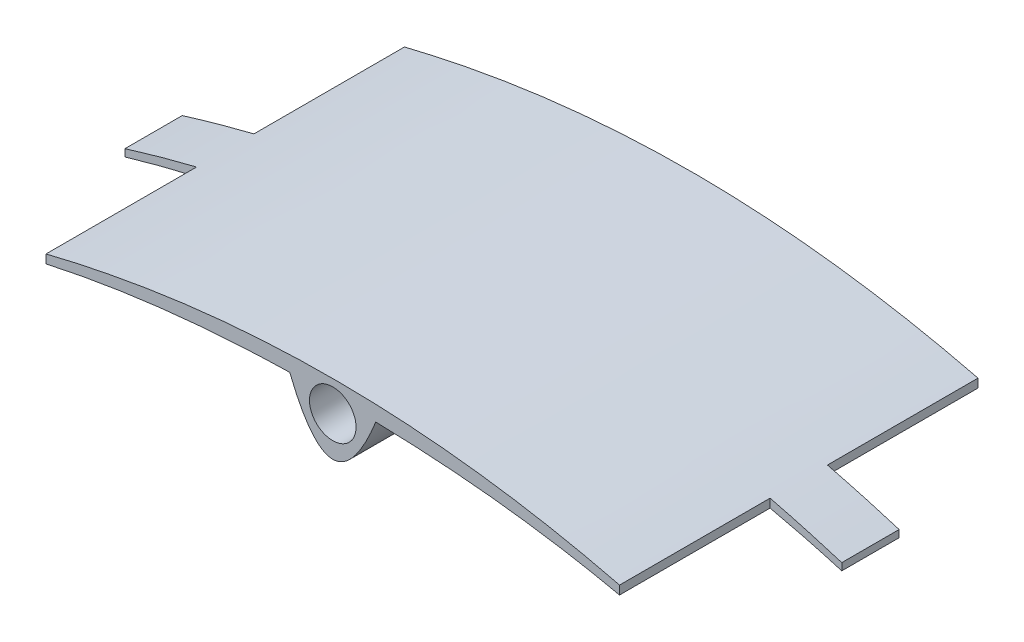
ISO-10303-21;
HEADER;
FILE_DESCRIPTION(('STEP AP214'),'2;1');
FILE_NAME('part.step','',(''),(''),'','','');
FILE_SCHEMA(('AUTOMOTIVE_DESIGN { 1 0 10303 214 1 1 1 1 }'));
ENDSEC;
DATA;
#1=APPLICATION_CONTEXT('core data for automotive mechanical design processes');
#2=APPLICATION_PROTOCOL_DEFINITION('international standard','automotive_design',2000,#1);
#3=PRODUCT_CONTEXT('',#1,'mechanical');
#4=PRODUCT('Part','Part','',(#3));
#5=PRODUCT_RELATED_PRODUCT_CATEGORY('part','',(#4));
#6=PRODUCT_DEFINITION_FORMATION('','',#4);
#7=PRODUCT_DEFINITION_CONTEXT('part definition',#1,'design');
#8=PRODUCT_DEFINITION('design','',#6,#7);
#9=PRODUCT_DEFINITION_SHAPE('','',#8);
#10=(LENGTH_UNIT() NAMED_UNIT(*) SI_UNIT(.MILLI.,.METRE.));
#11=(NAMED_UNIT(*) PLANE_ANGLE_UNIT() SI_UNIT($,.RADIAN.));
#12=(NAMED_UNIT(*) SI_UNIT($,.STERADIAN.) SOLID_ANGLE_UNIT());
#13=UNCERTAINTY_MEASURE_WITH_UNIT(LENGTH_MEASURE(1.E-05),#10,'distance_accuracy_value','');
#14=(GEOMETRIC_REPRESENTATION_CONTEXT(3) GLOBAL_UNCERTAINTY_ASSIGNED_CONTEXT((#13)) GLOBAL_UNIT_ASSIGNED_CONTEXT((#10,
#11,#12)) REPRESENTATION_CONTEXT('',''));
#15=CARTESIAN_POINT('',(0.,0.,0.));
#16=DIRECTION('',(0.,0.,1.));
#17=DIRECTION('',(1.,0.,0.));
#18=AXIS2_PLACEMENT_3D('',#15,#16,#17);
#19=CARTESIAN_POINT('',(0.,4.25967658803984,50.));
#20=DIRECTION('',(0.,0.,1.));
#21=DIRECTION('',(1.,0.,0.));
#22=AXIS2_PLACEMENT_3D('',#19,#20,#21);
#23=PLANE('',#22);
#24=DIRECTION('',(0.,1.,0.));
#25=VECTOR('',#24,1.);
#26=CARTESIAN_POINT('',(40.,-5.5,50.));
#27=LINE('',#26,#25);
#28=CARTESIAN_POINT('',(40.,-1.89787930509326,50.));
#29=VERTEX_POINT('',#28);
#30=CARTESIAN_POINT('',(40.,-0.694130395614659,50.));
#31=VERTEX_POINT('',#30);
#32=EDGE_CURVE('E158',#29,#31,#27,.T.);
#33=ORIENTED_EDGE('',*,*,#32,.T.);
#34=CARTESIAN_POINT('',(50.,-3.48064682392032,50.));
#35=CARTESIAN_POINT('',(0.,12.,50.));
#36=CARTESIAN_POINT('',(-50.,-3.48064682392032,50.));
#37=B_SPLINE_CURVE_WITH_KNOTS('',2,(#34,#35,#36),.UNSPECIFIED.,.F.,.F.,(3,3),(0.,1.),.UNSPECIFIED.);
#38=CARTESIAN_POINT('',(-40.,-0.694130395614659,50.));
#39=VERTEX_POINT('',#38);
#40=EDGE_CURVE('E166',#31,#39,#37,.T.);
#41=ORIENTED_EDGE('',*,*,#40,.T.);
#42=DIRECTION('',(0.,1.,0.));
#43=VECTOR('',#42,1.);
#44=CARTESIAN_POINT('',(-40.,-5.5,50.));
#45=LINE('',#44,#43);
#46=CARTESIAN_POINT('',(-40.,-1.89787930510449,50.));
#47=VERTEX_POINT('',#46);
#48=EDGE_CURVE('E249',#47,#39,#45,.T.);
#49=ORIENTED_EDGE('',*,*,#48,.F.);
#50=CARTESIAN_POINT('',(-50.,-4.48064682392032,50.));
#51=CARTESIAN_POINT('',(-30.,1.47316015973418,50.));
#52=CARTESIAN_POINT('',(-6.,2.,50.));
#53=B_SPLINE_CURVE_WITH_KNOTS('',2,(#50,#51,#52),.UNSPECIFIED.,.F.,.F.,(3,3),(0.,1.),.UNSPECIFIED.);
#54=CARTESIAN_POINT('',(-6.,2.,50.));
#55=VERTEX_POINT('',#54);
#56=EDGE_CURVE('E170',#47,#55,#53,.T.);
#57=ORIENTED_EDGE('',*,*,#56,.T.);
#58=CARTESIAN_POINT('',(-6.,2.,50.));
#59=CARTESIAN_POINT('',(0.,-13.,50.));
#60=CARTESIAN_POINT('',(6.,2.,50.));
#61=B_SPLINE_CURVE_WITH_KNOTS('',2,(#58,#59,#60),.UNSPECIFIED.,.F.,.F.,(3,3),(0.,1.),.UNSPECIFIED.);
#62=CARTESIAN_POINT('',(6.,2.,50.));
#63=VERTEX_POINT('',#62);
#64=EDGE_CURVE('E322',#55,#63,#61,.T.);
#65=ORIENTED_EDGE('',*,*,#64,.T.);
#66=CARTESIAN_POINT('',(6.,2.,50.));
#67=CARTESIAN_POINT('',(30.,1.47316015973418,50.));
#68=CARTESIAN_POINT('',(50.,-4.48064682392032,50.));
#69=B_SPLINE_CURVE_WITH_KNOTS('',2,(#66,#67,#68),.UNSPECIFIED.,.F.,.F.,(3,3),(0.,1.),.UNSPECIFIED.);
#70=EDGE_CURVE('E186',#63,#29,#69,.T.);
#71=ORIENTED_EDGE('',*,*,#70,.T.);
#72=EDGE_LOOP('',(#33,#41,#49,#57,#65,#71));
#73=FACE_BOUND('',#72,.T.);
#74=CARTESIAN_POINT('',(0.,0.,50.));
#75=DIRECTION('',(0.,0.,1.));
#76=DIRECTION('',(1.,0.,0.));
#77=AXIS2_PLACEMENT_3D('',#74,#75,#76);
#78=CIRCLE('',#77,3.25);
#79=CARTESIAN_POINT('',(3.25,0.,50.));
#80=VERTEX_POINT('',#79);
#81=EDGE_CURVE('E307',#80,#80,#78,.T.);
#82=ORIENTED_EDGE('',*,*,#81,.F.);
#83=EDGE_LOOP('',(#82));
#84=FACE_BOUND('',#83,.T.);
#85=ADVANCED_FACE('F33',(#73,#84),#23,.T.);
#86=CARTESIAN_POINT('',(0.,4.25967658803984,0.));
#87=DIRECTION('',(0.,0.,1.));
#88=DIRECTION('',(1.,0.,0.));
#89=AXIS2_PLACEMENT_3D('',#86,#87,#88);
#90=PLANE('',#89);
#91=CARTESIAN_POINT('',(50.,-3.48064682392032,0.));
#92=CARTESIAN_POINT('',(0.,12.,0.));
#93=CARTESIAN_POINT('',(-50.,-3.48064682392032,0.));
#94=B_SPLINE_CURVE_WITH_KNOTS('',2,(#91,#92,#93),.UNSPECIFIED.,.F.,.F.,(3,3),(0.,1.),.UNSPECIFIED.);
#95=CARTESIAN_POINT('',(40.,-0.69413039561466,0.));
#96=VERTEX_POINT('',#95);
#97=CARTESIAN_POINT('',(-40.,-0.694130395614659,0.));
#98=VERTEX_POINT('',#97);
#99=EDGE_CURVE('E157',#96,#98,#94,.T.);
#100=ORIENTED_EDGE('',*,*,#99,.F.);
#101=DIRECTION('',(0.,1.,0.));
#102=VECTOR('',#101,1.);
#103=CARTESIAN_POINT('',(40.,-5.5,0.));
#104=LINE('',#103,#102);
#105=CARTESIAN_POINT('',(40.,-1.89787930510449,0.));
#106=VERTEX_POINT('',#105);
#107=EDGE_CURVE('E138',#106,#96,#104,.T.);
#108=ORIENTED_EDGE('',*,*,#107,.F.);
#109=CARTESIAN_POINT('',(6.,2.,0.));
#110=CARTESIAN_POINT('',(30.,1.47316015973418,0.));
#111=CARTESIAN_POINT('',(50.,-4.48064682392032,0.));
#112=B_SPLINE_CURVE_WITH_KNOTS('',2,(#109,#110,#111),.UNSPECIFIED.,.F.,.F.,(3,3),(0.,1.),.UNSPECIFIED.);
#113=CARTESIAN_POINT('',(6.,2.,0.));
#114=VERTEX_POINT('',#113);
#115=EDGE_CURVE('E154',#114,#106,#112,.T.);
#116=ORIENTED_EDGE('',*,*,#115,.F.);
#117=CARTESIAN_POINT('',(-6.,2.,0.));
#118=CARTESIAN_POINT('',(0.,-13.,0.));
#119=CARTESIAN_POINT('',(6.,2.,0.));
#120=B_SPLINE_CURVE_WITH_KNOTS('',2,(#117,#118,#119),.UNSPECIFIED.,.F.,.F.,(3,3),(0.,1.),.UNSPECIFIED.);
#121=CARTESIAN_POINT('',(-6.,2.,0.));
#122=VERTEX_POINT('',#121);
#123=EDGE_CURVE('E167',#122,#114,#120,.T.);
#124=ORIENTED_EDGE('',*,*,#123,.F.);
#125=CARTESIAN_POINT('',(-50.,-4.48064682392032,0.));
#126=CARTESIAN_POINT('',(-30.,1.47316015973418,0.));
#127=CARTESIAN_POINT('',(-6.,2.,0.));
#128=B_SPLINE_CURVE_WITH_KNOTS('',2,(#125,#126,#127),.UNSPECIFIED.,.F.,.F.,(3,3),(0.,1.),.UNSPECIFIED.);
#129=CARTESIAN_POINT('',(-40.,-1.89787930509326,0.));
#130=VERTEX_POINT('',#129);
#131=EDGE_CURVE('E171',#130,#122,#128,.T.);
#132=ORIENTED_EDGE('',*,*,#131,.F.);
#133=DIRECTION('',(0.,1.,0.));
#134=VECTOR('',#133,1.);
#135=CARTESIAN_POINT('',(-40.,-5.5,0.));
#136=LINE('',#135,#134);
#137=EDGE_CURVE('E235',#130,#98,#136,.T.);
#138=ORIENTED_EDGE('',*,*,#137,.T.);
#139=EDGE_LOOP('',(#100,#108,#116,#124,#132,#138));
#140=FACE_BOUND('',#139,.T.);
#141=CARTESIAN_POINT('',(0.,0.,0.));
#142=DIRECTION('',(0.,0.,1.));
#143=DIRECTION('',(1.,0.,0.));
#144=AXIS2_PLACEMENT_3D('',#141,#142,#143);
#145=CIRCLE('',#144,3.25);
#146=CARTESIAN_POINT('',(3.25,0.,0.));
#147=VERTEX_POINT('',#146);
#148=EDGE_CURVE('E306',#147,#147,#145,.T.);
#149=ORIENTED_EDGE('',*,*,#148,.T.);
#150=EDGE_LOOP('',(#149));
#151=FACE_BOUND('',#150,.T.);
#152=ADVANCED_FACE('F151',(#140,#151),#90,.F.);
#153=DIRECTION('',(0.,0.,-1.));
#154=VECTOR('',#153,1.);
#155=SURFACE_OF_LINEAR_EXTRUSION('',#37,#154);
#156=ORIENTED_EDGE('',*,*,#40,.F.);
#157=DIRECTION('',(0.,0.,-1.));
#158=VECTOR('',#157,1.);
#159=CARTESIAN_POINT('',(40.,-0.694130395614658,50.));
#160=LINE('',#159,#158);
#161=CARTESIAN_POINT('',(40.,-0.69413039561466,29.));
#162=VERTEX_POINT('',#161);
#163=EDGE_CURVE('E282',#31,#162,#160,.T.);
#164=ORIENTED_EDGE('',*,*,#163,.T.);
#165=CARTESIAN_POINT('',(50.,-3.48064682392032,29.));
#166=CARTESIAN_POINT('',(0.,12.,29.));
#167=CARTESIAN_POINT('',(-50.,-3.48064682392032,29.));
#168=B_SPLINE_CURVE_WITH_KNOTS('',2,(#165,#166,#167),.UNSPECIFIED.,.F.,.F.,(3,3),(0.,1.),.UNSPECIFIED.);
#169=CARTESIAN_POINT('',(50.,-3.48064682392032,29.));
#170=VERTEX_POINT('',#169);
#171=EDGE_CURVE('E269',#162,#170,#168,.F.);
#172=ORIENTED_EDGE('',*,*,#171,.T.);
#173=DIRECTION('',(0.,0.,-1.));
#174=VECTOR('',#173,1.);
#175=CARTESIAN_POINT('',(50.,-3.48064682392032,50.));
#176=LINE('',#175,#174);
#177=CARTESIAN_POINT('',(50.,-3.48064682392032,21.));
#178=VERTEX_POINT('',#177);
#179=EDGE_CURVE('E179',#170,#178,#176,.T.);
#180=ORIENTED_EDGE('',*,*,#179,.T.);
#181=CARTESIAN_POINT('',(50.,-3.48064682392032,21.));
#182=CARTESIAN_POINT('',(0.,12.,21.));
#183=CARTESIAN_POINT('',(-50.,-3.48064682392032,21.));
#184=B_SPLINE_CURVE_WITH_KNOTS('',2,(#181,#182,#183),.UNSPECIFIED.,.F.,.F.,(3,3),(0.,1.),.UNSPECIFIED.);
#185=CARTESIAN_POINT('',(40.,-0.694130395614659,21.));
#186=VERTEX_POINT('',#185);
#187=EDGE_CURVE('E254',#178,#186,#184,.T.);
#188=ORIENTED_EDGE('',*,*,#187,.T.);
#189=DIRECTION('',(0.,0.,-1.));
#190=VECTOR('',#189,1.);
#191=CARTESIAN_POINT('',(40.,-0.694130395614658,50.));
#192=LINE('',#191,#190);
#193=EDGE_CURVE('E277',#186,#96,#192,.T.);
#194=ORIENTED_EDGE('',*,*,#193,.T.);
#195=ORIENTED_EDGE('',*,*,#99,.T.);
#196=DIRECTION('',(0.,0.,-1.));
#197=VECTOR('',#196,1.);
#198=CARTESIAN_POINT('',(-40.,-0.694130395614659,50.));
#199=LINE('',#198,#197);
#200=CARTESIAN_POINT('',(-40.,-0.694130395614659,21.));
#201=VERTEX_POINT('',#200);
#202=EDGE_CURVE('E300',#98,#201,#199,.F.);
#203=ORIENTED_EDGE('',*,*,#202,.T.);
#204=CARTESIAN_POINT('',(50.,-3.48064682392032,21.));
#205=CARTESIAN_POINT('',(0.,12.,21.));
#206=CARTESIAN_POINT('',(-50.,-3.48064682392032,21.));
#207=B_SPLINE_CURVE_WITH_KNOTS('',2,(#204,#205,#206),.UNSPECIFIED.,.F.,.F.,(3,3),(0.,1.),.UNSPECIFIED.);
#208=CARTESIAN_POINT('',(-50.,-3.48064682392032,21.));
#209=VERTEX_POINT('',#208);
#210=EDGE_CURVE('E293',#201,#209,#207,.T.);
#211=ORIENTED_EDGE('',*,*,#210,.T.);
#212=DIRECTION('',(0.,0.,-1.));
#213=VECTOR('',#212,1.);
#214=CARTESIAN_POINT('',(-50.,-3.48064682392032,50.));
#215=LINE('',#214,#213);
#216=CARTESIAN_POINT('',(-50.,-3.48064682392032,29.));
#217=VERTEX_POINT('',#216);
#218=EDGE_CURVE('E196',#217,#209,#215,.T.);
#219=ORIENTED_EDGE('',*,*,#218,.F.);
#220=CARTESIAN_POINT('',(50.,-3.48064682392032,29.));
#221=CARTESIAN_POINT('',(0.,12.,29.));
#222=CARTESIAN_POINT('',(-50.,-3.48064682392032,29.));
#223=B_SPLINE_CURVE_WITH_KNOTS('',2,(#220,#221,#222),.UNSPECIFIED.,.F.,.F.,(3,3),(0.,1.),.UNSPECIFIED.);
#224=CARTESIAN_POINT('',(-40.,-0.694130395614659,29.));
#225=VERTEX_POINT('',#224);
#226=EDGE_CURVE('E288',#217,#225,#223,.F.);
#227=ORIENTED_EDGE('',*,*,#226,.T.);
#228=DIRECTION('',(0.,0.,-1.));
#229=VECTOR('',#228,1.);
#230=CARTESIAN_POINT('',(-40.,-0.694130395614659,50.));
#231=LINE('',#230,#229);
#232=EDGE_CURVE('E285',#225,#39,#231,.F.);
#233=ORIENTED_EDGE('',*,*,#232,.T.);
#234=EDGE_LOOP('',(#156,#164,#172,#180,#188,#194,#195,#203,#211,#219,#227,#233));
#235=FACE_BOUND('',#234,.T.);
#236=ADVANCED_FACE('F35',(#235),#155,.F.);
#237=CARTESIAN_POINT('',(-50.,-3.48064682392032,50.));
#238=DIRECTION('',(1.,0.,0.));
#239=DIRECTION('',(0.,0.,-1.));
#240=AXIS2_PLACEMENT_3D('',#237,#238,#239);
#241=PLANE('',#240);
#242=ORIENTED_EDGE('',*,*,#218,.T.);
#243=DIRECTION('',(0.,1.,0.));
#244=VECTOR('',#243,1.);
#245=CARTESIAN_POINT('',(-50.,-5.5,21.));
#246=LINE('',#245,#244);
#247=CARTESIAN_POINT('',(-50.,-4.48064682392032,21.));
#248=VERTEX_POINT('',#247);
#249=EDGE_CURVE('E228',#248,#209,#246,.T.);
#250=ORIENTED_EDGE('',*,*,#249,.F.);
#251=DIRECTION('',(0.,0.,-1.));
#252=VECTOR('',#251,1.);
#253=CARTESIAN_POINT('',(-50.,-4.48064682392032,50.));
#254=LINE('',#253,#252);
#255=CARTESIAN_POINT('',(-50.,-4.48064682392032,29.));
#256=VERTEX_POINT('',#255);
#257=EDGE_CURVE('E193',#256,#248,#254,.T.);
#258=ORIENTED_EDGE('',*,*,#257,.F.);
#259=DIRECTION('',(0.,1.,0.));
#260=VECTOR('',#259,1.);
#261=CARTESIAN_POINT('',(-50.,-5.5,29.));
#262=LINE('',#261,#260);
#263=EDGE_CURVE('E245',#256,#217,#262,.T.);
#264=ORIENTED_EDGE('',*,*,#263,.T.);
#265=EDGE_LOOP('',(#242,#250,#258,#264));
#266=FACE_BOUND('',#265,.T.);
#267=ADVANCED_FACE('F231',(#266),#241,.F.);
#268=DIRECTION('',(0.,0.,-1.));
#269=VECTOR('',#268,1.);
#270=SURFACE_OF_LINEAR_EXTRUSION('',#53,#269);
#271=CARTESIAN_POINT('',(-50.,-4.48064682392032,21.));
#272=CARTESIAN_POINT('',(-30.,1.47316015973418,21.));
#273=CARTESIAN_POINT('',(-6.,2.,21.));
#274=B_SPLINE_CURVE_WITH_KNOTS('',2,(#271,#272,#273),.UNSPECIFIED.,.F.,.F.,(3,3),(0.,1.),.UNSPECIFIED.);
#275=CARTESIAN_POINT('',(-40.0000000000509,-1.89787930510449,21.));
#276=VERTEX_POINT('',#275);
#277=EDGE_CURVE('E42',#248,#276,#274,.T.);
#278=ORIENTED_EDGE('',*,*,#277,.T.);
#279=DIRECTION('',(0.,0.,-1.));
#280=VECTOR('',#279,1.);
#281=CARTESIAN_POINT('',(-40.,-1.89787930509326,50.));
#282=LINE('',#281,#280);
#283=EDGE_CURVE('E11',#276,#130,#282,.T.);
#284=ORIENTED_EDGE('',*,*,#283,.T.);
#285=ORIENTED_EDGE('',*,*,#131,.T.);
#286=DIRECTION('',(0.,0.,-1.));
#287=VECTOR('',#286,1.);
#288=CARTESIAN_POINT('',(-6.,2.,50.));
#289=LINE('',#288,#287);
#290=EDGE_CURVE('E190',#55,#122,#289,.T.);
#291=ORIENTED_EDGE('',*,*,#290,.F.);
#292=ORIENTED_EDGE('',*,*,#56,.F.);
#293=DIRECTION('',(0.,0.,-1.));
#294=VECTOR('',#293,1.);
#295=CARTESIAN_POINT('',(-40.,-1.89787930509325,50.));
#296=LINE('',#295,#294);
#297=CARTESIAN_POINT('',(-40.,-1.89787930509325,29.));
#298=VERTEX_POINT('',#297);
#299=EDGE_CURVE('E206',#47,#298,#296,.T.);
#300=ORIENTED_EDGE('',*,*,#299,.T.);
#301=CARTESIAN_POINT('',(-50.,-4.48064682392032,29.));
#302=CARTESIAN_POINT('',(-30.,1.47316015973418,29.));
#303=CARTESIAN_POINT('',(-6.,2.,29.));
#304=B_SPLINE_CURVE_WITH_KNOTS('',2,(#301,#302,#303),.UNSPECIFIED.,.F.,.F.,(3,3),(0.,1.),.UNSPECIFIED.);
#305=EDGE_CURVE('E209',#298,#256,#304,.F.);
#306=ORIENTED_EDGE('',*,*,#305,.T.);
#307=ORIENTED_EDGE('',*,*,#257,.T.);
#308=EDGE_LOOP('',(#278,#284,#285,#291,#292,#300,#306,#307));
#309=FACE_BOUND('',#308,.T.);
#310=ADVANCED_FACE('F223',(#309),#270,.F.);
#311=DIRECTION('',(0.,0.,-1.));
#312=VECTOR('',#311,1.);
#313=SURFACE_OF_LINEAR_EXTRUSION('',#61,#312);
#314=ORIENTED_EDGE('',*,*,#123,.T.);
#315=DIRECTION('',(0.,0.,-1.));
#316=VECTOR('',#315,1.);
#317=CARTESIAN_POINT('',(6.,2.,50.));
#318=LINE('',#317,#316);
#319=EDGE_CURVE('E165',#63,#114,#318,.T.);
#320=ORIENTED_EDGE('',*,*,#319,.F.);
#321=ORIENTED_EDGE('',*,*,#64,.F.);
#322=ORIENTED_EDGE('',*,*,#290,.T.);
#323=EDGE_LOOP('',(#314,#320,#321,#322));
#324=FACE_BOUND('',#323,.T.);
#325=ADVANCED_FACE('F333',(#324),#313,.F.);
#326=DIRECTION('',(0.,0.,-1.));
#327=VECTOR('',#326,1.);
#328=SURFACE_OF_LINEAR_EXTRUSION('',#69,#327);
#329=CARTESIAN_POINT('',(6.,2.,29.));
#330=CARTESIAN_POINT('',(30.,1.47316015973418,29.));
#331=CARTESIAN_POINT('',(50.,-4.48064682392032,29.));
#332=B_SPLINE_CURVE_WITH_KNOTS('',2,(#329,#330,#331),.UNSPECIFIED.,.F.,.F.,(3,3),(0.,1.),.UNSPECIFIED.);
#333=CARTESIAN_POINT('',(50.,-4.48064682392032,29.));
#334=VERTEX_POINT('',#333);
#335=CARTESIAN_POINT('',(40.,-1.89787930510449,29.));
#336=VERTEX_POINT('',#335);
#337=EDGE_CURVE('E262',#334,#336,#332,.F.);
#338=ORIENTED_EDGE('',*,*,#337,.T.);
#339=DIRECTION('',(0.,0.,-1.));
#340=VECTOR('',#339,1.);
#341=CARTESIAN_POINT('',(40.,-1.89787930509326,50.));
#342=LINE('',#341,#340);
#343=EDGE_CURVE('E145',#336,#29,#342,.F.);
#344=ORIENTED_EDGE('',*,*,#343,.T.);
#345=ORIENTED_EDGE('',*,*,#70,.F.);
#346=ORIENTED_EDGE('',*,*,#319,.T.);
#347=ORIENTED_EDGE('',*,*,#115,.T.);
#348=DIRECTION('',(0.,0.,-1.));
#349=VECTOR('',#348,1.);
#350=CARTESIAN_POINT('',(40.,-1.89787930509326,50.));
#351=LINE('',#350,#349);
#352=CARTESIAN_POINT('',(40.,-1.89787930509326,21.));
#353=VERTEX_POINT('',#352);
#354=EDGE_CURVE('E135',#106,#353,#351,.F.);
#355=ORIENTED_EDGE('',*,*,#354,.T.);
#356=CARTESIAN_POINT('',(6.,2.,21.));
#357=CARTESIAN_POINT('',(30.,1.47316015973418,21.));
#358=CARTESIAN_POINT('',(50.,-4.48064682392032,21.));
#359=B_SPLINE_CURVE_WITH_KNOTS('',2,(#356,#357,#358),.UNSPECIFIED.,.F.,.F.,(3,3),(0.,1.),.UNSPECIFIED.);
#360=CARTESIAN_POINT('',(50.,-4.48064682392032,21.));
#361=VERTEX_POINT('',#360);
#362=EDGE_CURVE('E247',#353,#361,#359,.T.);
#363=ORIENTED_EDGE('',*,*,#362,.T.);
#364=DIRECTION('',(0.,0.,-1.));
#365=VECTOR('',#364,1.);
#366=CARTESIAN_POINT('',(50.,-4.48064682392032,50.));
#367=LINE('',#366,#365);
#368=EDGE_CURVE('E185',#334,#361,#367,.T.);
#369=ORIENTED_EDGE('',*,*,#368,.F.);
#370=EDGE_LOOP('',(#338,#344,#345,#346,#347,#355,#363,#369));
#371=FACE_BOUND('',#370,.T.);
#372=ADVANCED_FACE('F162',(#371),#328,.F.);
#373=CARTESIAN_POINT('',(50.,-3.48064682392032,50.));
#374=DIRECTION('',(-1.,0.,0.));
#375=DIRECTION('',(0.,0.,1.));
#376=AXIS2_PLACEMENT_3D('',#373,#374,#375);
#377=PLANE('',#376);
#378=ORIENTED_EDGE('',*,*,#179,.F.);
#379=DIRECTION('',(0.,-1.,0.));
#380=VECTOR('',#379,1.);
#381=CARTESIAN_POINT('',(50.,-3.48064682392032,29.));
#382=LINE('',#381,#380);
#383=EDGE_CURVE('E146',#170,#334,#382,.T.);
#384=ORIENTED_EDGE('',*,*,#383,.T.);
#385=ORIENTED_EDGE('',*,*,#368,.T.);
#386=DIRECTION('',(0.,1.,0.));
#387=VECTOR('',#386,1.);
#388=CARTESIAN_POINT('',(50.,-3.48064682392032,21.));
#389=LINE('',#388,#387);
#390=EDGE_CURVE('E199',#361,#178,#389,.T.);
#391=ORIENTED_EDGE('',*,*,#390,.T.);
#392=EDGE_LOOP('',(#378,#384,#385,#391));
#393=FACE_BOUND('',#392,.T.);
#394=ADVANCED_FACE('F352',(#393),#377,.F.);
#395=CARTESIAN_POINT('',(0.,0.,50.));
#396=DIRECTION('',(0.,0.,-1.));
#397=DIRECTION('',(-1.,0.,0.));
#398=AXIS2_PLACEMENT_3D('',#395,#396,#397);
#399=CYLINDRICAL_SURFACE('',#398,3.25);
#400=ORIENTED_EDGE('',*,*,#81,.T.);
#401=EDGE_LOOP('',(#400));
#402=FACE_BOUND('',#401,.T.);
#403=ORIENTED_EDGE('',*,*,#148,.F.);
#404=EDGE_LOOP('',(#403));
#405=FACE_BOUND('',#404,.T.);
#406=ADVANCED_FACE('F349',(#402,#405),#399,.F.);
#407=CARTESIAN_POINT('',(40.,-5.5,0.));
#408=DIRECTION('',(-1.,0.,0.));
#409=DIRECTION('',(0.,0.,1.));
#410=AXIS2_PLACEMENT_3D('',#407,#408,#409);
#411=PLANE('',#410);
#412=DIRECTION('',(0.,1.,0.));
#413=VECTOR('',#412,1.);
#414=CARTESIAN_POINT('',(40.,-5.5,21.));
#415=LINE('',#414,#413);
#416=EDGE_CURVE('E141',#353,#186,#415,.T.);
#417=ORIENTED_EDGE('',*,*,#416,.F.);
#418=ORIENTED_EDGE('',*,*,#354,.F.);
#419=ORIENTED_EDGE('',*,*,#107,.T.);
#420=ORIENTED_EDGE('',*,*,#193,.F.);
#421=EDGE_LOOP('',(#417,#418,#419,#420));
#422=FACE_BOUND('',#421,.T.);
#423=ADVANCED_FACE('F137',(#422),#411,.F.);
#424=CARTESIAN_POINT('',(50.,-5.5,21.));
#425=DIRECTION('',(0.,0.,1.));
#426=DIRECTION('',(1.,0.,0.));
#427=AXIS2_PLACEMENT_3D('',#424,#425,#426);
#428=PLANE('',#427);
#429=ORIENTED_EDGE('',*,*,#390,.F.);
#430=ORIENTED_EDGE('',*,*,#362,.F.);
#431=ORIENTED_EDGE('',*,*,#416,.T.);
#432=ORIENTED_EDGE('',*,*,#187,.F.);
#433=EDGE_LOOP('',(#429,#430,#431,#432));
#434=FACE_BOUND('',#433,.T.);
#435=ADVANCED_FACE('F389',(#434),#428,.F.);
#436=CARTESIAN_POINT('',(40.,-5.5,50.));
#437=DIRECTION('',(-1.,0.,0.));
#438=DIRECTION('',(0.,0.,1.));
#439=AXIS2_PLACEMENT_3D('',#436,#437,#438);
#440=PLANE('',#439);
#441=ORIENTED_EDGE('',*,*,#32,.F.);
#442=ORIENTED_EDGE('',*,*,#343,.F.);
#443=DIRECTION('',(0.,1.,0.));
#444=VECTOR('',#443,1.);
#445=CARTESIAN_POINT('',(40.,-5.5,29.));
#446=LINE('',#445,#444);
#447=EDGE_CURVE('E242',#336,#162,#446,.T.);
#448=ORIENTED_EDGE('',*,*,#447,.T.);
#449=ORIENTED_EDGE('',*,*,#163,.F.);
#450=EDGE_LOOP('',(#441,#442,#448,#449));
#451=FACE_BOUND('',#450,.T.);
#452=ADVANCED_FACE('F382',(#451),#440,.F.);
#453=CARTESIAN_POINT('',(50.,-5.5,29.));
#454=DIRECTION('',(0.,0.,-1.));
#455=DIRECTION('',(-1.,0.,0.));
#456=AXIS2_PLACEMENT_3D('',#453,#454,#455);
#457=PLANE('',#456);
#458=ORIENTED_EDGE('',*,*,#447,.F.);
#459=ORIENTED_EDGE('',*,*,#337,.F.);
#460=ORIENTED_EDGE('',*,*,#383,.F.);
#461=ORIENTED_EDGE('',*,*,#171,.F.);
#462=EDGE_LOOP('',(#458,#459,#460,#461));
#463=FACE_BOUND('',#462,.T.);
#464=ADVANCED_FACE('F386',(#463),#457,.F.);
#465=CARTESIAN_POINT('',(-50.,-5.5,29.));
#466=DIRECTION('',(0.,0.,-1.));
#467=DIRECTION('',(-1.,0.,0.));
#468=AXIS2_PLACEMENT_3D('',#465,#466,#467);
#469=PLANE('',#468);
#470=ORIENTED_EDGE('',*,*,#263,.F.);
#471=ORIENTED_EDGE('',*,*,#305,.F.);
#472=DIRECTION('',(0.,1.,0.));
#473=VECTOR('',#472,1.);
#474=CARTESIAN_POINT('',(-40.,-5.5,29.));
#475=LINE('',#474,#473);
#476=EDGE_CURVE('E57',#298,#225,#475,.T.);
#477=ORIENTED_EDGE('',*,*,#476,.T.);
#478=ORIENTED_EDGE('',*,*,#226,.F.);
#479=EDGE_LOOP('',(#470,#471,#477,#478));
#480=FACE_BOUND('',#479,.T.);
#481=ADVANCED_FACE('F403',(#480),#469,.F.);
#482=CARTESIAN_POINT('',(-40.,-5.5,50.));
#483=DIRECTION('',(1.,0.,0.));
#484=DIRECTION('',(0.,0.,-1.));
#485=AXIS2_PLACEMENT_3D('',#482,#483,#484);
#486=PLANE('',#485);
#487=ORIENTED_EDGE('',*,*,#476,.F.);
#488=ORIENTED_EDGE('',*,*,#299,.F.);
#489=ORIENTED_EDGE('',*,*,#48,.T.);
#490=ORIENTED_EDGE('',*,*,#232,.F.);
#491=EDGE_LOOP('',(#487,#488,#489,#490));
#492=FACE_BOUND('',#491,.T.);
#493=ADVANCED_FACE('F379',(#492),#486,.F.);
#494=CARTESIAN_POINT('',(-40.,-5.5,0.));
#495=DIRECTION('',(1.,0.,0.));
#496=DIRECTION('',(0.,0.,-1.));
#497=AXIS2_PLACEMENT_3D('',#494,#495,#496);
#498=PLANE('',#497);
#499=ORIENTED_EDGE('',*,*,#137,.F.);
#500=ORIENTED_EDGE('',*,*,#283,.F.);
#501=DIRECTION('',(0.,1.,0.));
#502=VECTOR('',#501,1.);
#503=CARTESIAN_POINT('',(-40.,-5.5,21.));
#504=LINE('',#503,#502);
#505=EDGE_CURVE('E49',#276,#201,#504,.T.);
#506=ORIENTED_EDGE('',*,*,#505,.T.);
#507=ORIENTED_EDGE('',*,*,#202,.F.);
#508=EDGE_LOOP('',(#499,#500,#506,#507));
#509=FACE_BOUND('',#508,.T.);
#510=ADVANCED_FACE('F407',(#509),#498,.F.);
#511=CARTESIAN_POINT('',(-50.,-5.5,21.));
#512=DIRECTION('',(0.,0.,1.));
#513=DIRECTION('',(1.,0.,0.));
#514=AXIS2_PLACEMENT_3D('',#511,#512,#513);
#515=PLANE('',#514);
#516=ORIENTED_EDGE('',*,*,#505,.F.);
#517=ORIENTED_EDGE('',*,*,#277,.F.);
#518=ORIENTED_EDGE('',*,*,#249,.T.);
#519=ORIENTED_EDGE('',*,*,#210,.F.);
#520=EDGE_LOOP('',(#516,#517,#518,#519));
#521=FACE_BOUND('',#520,.T.);
#522=ADVANCED_FACE('F227',(#521),#515,.F.);
#523=CLOSED_SHELL('',(#85,#152,#236,#267,#310,#325,#372,#394,#406,#423,#435,#452,#464,#481,#493,
#510,#522));
#524=MANIFOLD_SOLID_BREP('B2',#523);
#525=ADVANCED_BREP_SHAPE_REPRESENTATION('',(#18,#524),#14);
#526=SHAPE_DEFINITION_REPRESENTATION(#9,#525);
ENDSEC;
END-ISO-10303-21;
